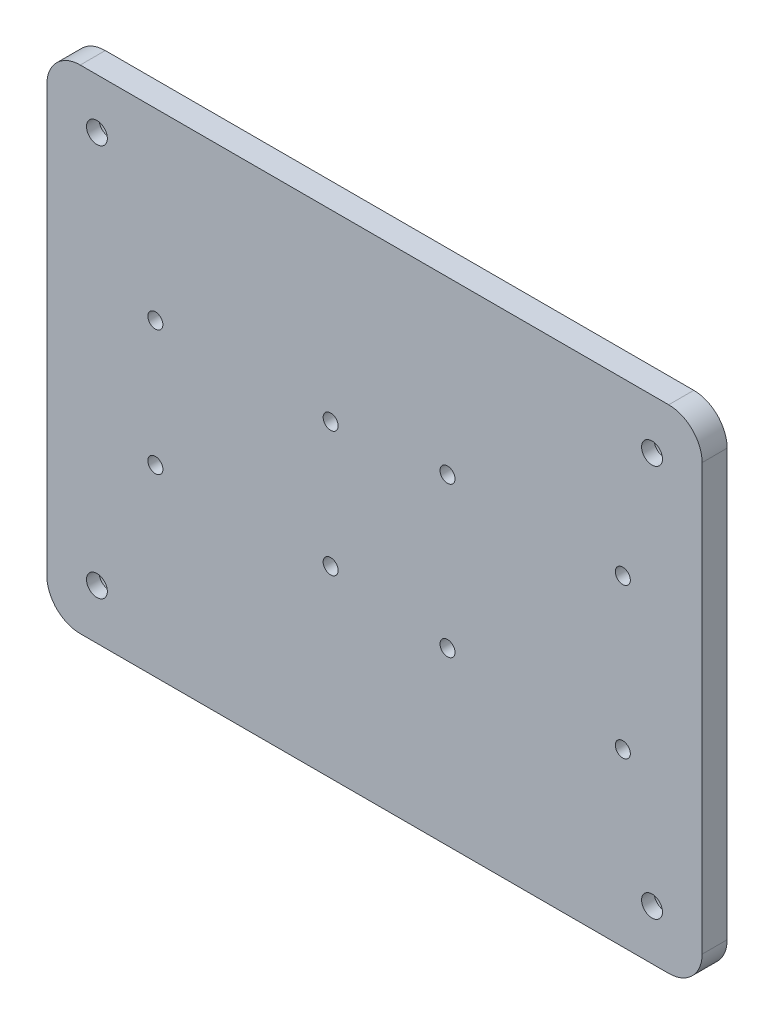
ISO-10303-21;
HEADER;
FILE_DESCRIPTION(('STEP AP214'),'2;1');
FILE_NAME('part.step','',(''),(''),'','','');
FILE_SCHEMA(('AUTOMOTIVE_DESIGN { 1 0 10303 214 1 1 1 1 }'));
ENDSEC;
DATA;
#1=APPLICATION_CONTEXT('core data for automotive mechanical design processes');
#2=APPLICATION_PROTOCOL_DEFINITION('international standard','automotive_design',2000,#1);
#3=PRODUCT_CONTEXT('',#1,'mechanical');
#4=PRODUCT('Part','Part','',(#3));
#5=PRODUCT_RELATED_PRODUCT_CATEGORY('part','',(#4));
#6=PRODUCT_DEFINITION_FORMATION('','',#4);
#7=PRODUCT_DEFINITION_CONTEXT('part definition',#1,'design');
#8=PRODUCT_DEFINITION('design','',#6,#7);
#9=PRODUCT_DEFINITION_SHAPE('','',#8);
#10=(LENGTH_UNIT() NAMED_UNIT(*) SI_UNIT(.MILLI.,.METRE.));
#11=(NAMED_UNIT(*) PLANE_ANGLE_UNIT() SI_UNIT($,.RADIAN.));
#12=(NAMED_UNIT(*) SI_UNIT($,.STERADIAN.) SOLID_ANGLE_UNIT());
#13=UNCERTAINTY_MEASURE_WITH_UNIT(LENGTH_MEASURE(1.E-05),#10,'distance_accuracy_value','');
#14=(GEOMETRIC_REPRESENTATION_CONTEXT(3) GLOBAL_UNCERTAINTY_ASSIGNED_CONTEXT((#13)) GLOBAL_UNIT_ASSIGNED_CONTEXT((#10,
#11,#12)) REPRESENTATION_CONTEXT('',''));
#15=CARTESIAN_POINT('',(0.,0.,0.));
#16=DIRECTION('',(0.,0.,1.));
#17=DIRECTION('',(1.,0.,0.));
#18=AXIS2_PLACEMENT_3D('',#15,#16,#17);
#19=CARTESIAN_POINT('',(174.,-12.,20.));
#20=DIRECTION('',(0.,0.,-1.));
#21=DIRECTION('',(-1.,0.,0.));
#22=AXIS2_PLACEMENT_3D('',#19,#20,#21);
#23=CYLINDRICAL_SURFACE('',#22,1.25000000000001);
#24=CARTESIAN_POINT('',(174.,-12.,20.));
#25=DIRECTION('',(0.,0.,-1.));
#26=DIRECTION('',(-1.,0.,0.));
#27=AXIS2_PLACEMENT_3D('',#24,#25,#26);
#28=CIRCLE('',#27,1.25000000000001);
#29=CARTESIAN_POINT('',(172.75,-12.,20.));
#30=VERTEX_POINT('',#29);
#31=EDGE_CURVE('E171',#30,#30,#28,.T.);
#32=ORIENTED_EDGE('',*,*,#31,.F.);
#33=EDGE_LOOP('',(#32));
#34=FACE_BOUND('',#33,.T.);
#35=CARTESIAN_POINT('',(174.,-12.,18.5));
#36=DIRECTION('',(0.,0.,-1.));
#37=DIRECTION('',(-1.,0.,0.));
#38=AXIS2_PLACEMENT_3D('',#35,#36,#37);
#39=CIRCLE('',#38,1.25000000000001);
#40=CARTESIAN_POINT('',(172.75,-12.,18.5));
#41=VERTEX_POINT('',#40);
#42=EDGE_CURVE('E178',#41,#41,#39,.F.);
#43=ORIENTED_EDGE('',*,*,#42,.F.);
#44=EDGE_LOOP('',(#43));
#45=FACE_BOUND('',#44,.T.);
#46=ADVANCED_FACE('F41',(#34,#45),#23,.F.);
#47=CARTESIAN_POINT('',(107.5,-12.,20.));
#48=DIRECTION('',(0.,0.,-1.));
#49=DIRECTION('',(-1.,0.,0.));
#50=AXIS2_PLACEMENT_3D('',#47,#48,#49);
#51=CYLINDRICAL_SURFACE('',#50,1.25000000000001);
#52=CARTESIAN_POINT('',(107.5,-12.,20.));
#53=DIRECTION('',(0.,0.,-1.));
#54=DIRECTION('',(-1.,0.,0.));
#55=AXIS2_PLACEMENT_3D('',#52,#53,#54);
#56=CIRCLE('',#55,1.25000000000001);
#57=CARTESIAN_POINT('',(106.25,-12.,20.));
#58=VERTEX_POINT('',#57);
#59=EDGE_CURVE('E168',#58,#58,#56,.T.);
#60=ORIENTED_EDGE('',*,*,#59,.F.);
#61=EDGE_LOOP('',(#60));
#62=FACE_BOUND('',#61,.T.);
#63=CARTESIAN_POINT('',(107.5,-12.,18.5));
#64=DIRECTION('',(0.,0.,-1.));
#65=DIRECTION('',(-1.,0.,0.));
#66=AXIS2_PLACEMENT_3D('',#63,#64,#65);
#67=CIRCLE('',#66,1.25000000000001);
#68=CARTESIAN_POINT('',(106.25,-12.,18.5));
#69=VERTEX_POINT('',#68);
#70=EDGE_CURVE('E191',#69,#69,#67,.F.);
#71=ORIENTED_EDGE('',*,*,#70,.F.);
#72=EDGE_LOOP('',(#71));
#73=FACE_BOUND('',#72,.T.);
#74=ADVANCED_FACE('F318',(#62,#73),#51,.F.);
#75=CARTESIAN_POINT('',(107.5,35.,20.));
#76=DIRECTION('',(0.,0.,-1.));
#77=DIRECTION('',(-1.,0.,0.));
#78=AXIS2_PLACEMENT_3D('',#75,#76,#77);
#79=CYLINDRICAL_SURFACE('',#78,1.25000000000001);
#80=CARTESIAN_POINT('',(107.5,35.,20.));
#81=DIRECTION('',(0.,0.,-1.));
#82=DIRECTION('',(-1.,0.,0.));
#83=AXIS2_PLACEMENT_3D('',#80,#81,#82);
#84=CIRCLE('',#83,1.25000000000001);
#85=CARTESIAN_POINT('',(106.25,35.,20.));
#86=VERTEX_POINT('',#85);
#87=EDGE_CURVE('E172',#86,#86,#84,.T.);
#88=ORIENTED_EDGE('',*,*,#87,.F.);
#89=EDGE_LOOP('',(#88));
#90=FACE_BOUND('',#89,.T.);
#91=CARTESIAN_POINT('',(107.5,35.,18.5));
#92=DIRECTION('',(0.,0.,-1.));
#93=DIRECTION('',(-1.,0.,0.));
#94=AXIS2_PLACEMENT_3D('',#91,#92,#93);
#95=CIRCLE('',#94,1.25000000000001);
#96=CARTESIAN_POINT('',(106.25,35.,18.5));
#97=VERTEX_POINT('',#96);
#98=EDGE_CURVE('E188',#97,#97,#95,.F.);
#99=ORIENTED_EDGE('',*,*,#98,.F.);
#100=EDGE_LOOP('',(#99));
#101=FACE_BOUND('',#100,.T.);
#102=ADVANCED_FACE('F324',(#90,#101),#79,.F.);
#103=CARTESIAN_POINT('',(174.,35.,20.));
#104=DIRECTION('',(0.,0.,-1.));
#105=DIRECTION('',(-1.,0.,0.));
#106=AXIS2_PLACEMENT_3D('',#103,#104,#105);
#107=CYLINDRICAL_SURFACE('',#106,1.25000000000001);
#108=CARTESIAN_POINT('',(174.,35.,20.));
#109=DIRECTION('',(0.,0.,-1.));
#110=DIRECTION('',(-1.,0.,0.));
#111=AXIS2_PLACEMENT_3D('',#108,#109,#110);
#112=CIRCLE('',#111,1.25000000000001);
#113=CARTESIAN_POINT('',(172.75,35.,20.));
#114=VERTEX_POINT('',#113);
#115=EDGE_CURVE('E175',#114,#114,#112,.T.);
#116=ORIENTED_EDGE('',*,*,#115,.F.);
#117=EDGE_LOOP('',(#116));
#118=FACE_BOUND('',#117,.T.);
#119=CARTESIAN_POINT('',(174.,35.,18.5));
#120=DIRECTION('',(0.,0.,-1.));
#121=DIRECTION('',(-1.,0.,0.));
#122=AXIS2_PLACEMENT_3D('',#119,#120,#121);
#123=CIRCLE('',#122,1.25000000000001);
#124=CARTESIAN_POINT('',(172.75,35.,18.5));
#125=VERTEX_POINT('',#124);
#126=EDGE_CURVE('E167',#125,#125,#123,.F.);
#127=ORIENTED_EDGE('',*,*,#126,.F.);
#128=EDGE_LOOP('',(#127));
#129=FACE_BOUND('',#128,.T.);
#130=ADVANCED_FACE('F284',(#118,#129),#107,.F.);
#131=CARTESIAN_POINT('',(140.,0.,17.));
#132=DIRECTION('',(0.,0.,1.));
#133=DIRECTION('',(1.,0.,0.));
#134=AXIS2_PLACEMENT_3D('',#131,#132,#133);
#135=PLANE('',#134);
#136=CARTESIAN_POINT('',(135.5,4.,17.));
#137=DIRECTION('',(0.,0.,-1.));
#138=DIRECTION('',(-1.,0.,0.));
#139=AXIS2_PLACEMENT_3D('',#136,#137,#138);
#140=CIRCLE('',#139,0.900000000000005);
#141=CARTESIAN_POINT('',(134.6,4.,17.));
#142=VERTEX_POINT('',#141);
#143=EDGE_CURVE('E253',#142,#142,#140,.T.);
#144=ORIENTED_EDGE('',*,*,#143,.F.);
#145=EDGE_LOOP('',(#144));
#146=FACE_BOUND('',#145,.T.);
#147=CARTESIAN_POINT('',(149.500000000001,2.49999999999999,17.));
#148=DIRECTION('',(0.,0.,-1.));
#149=DIRECTION('',(-1.,0.,0.));
#150=AXIS2_PLACEMENT_3D('',#147,#148,#149);
#151=CIRCLE('',#150,0.900000000000005);
#152=CARTESIAN_POINT('',(148.600000000001,2.49999999999999,17.));
#153=VERTEX_POINT('',#152);
#154=EDGE_CURVE('E242',#153,#153,#151,.T.);
#155=ORIENTED_EDGE('',*,*,#154,.F.);
#156=EDGE_LOOP('',(#155));
#157=FACE_BOUND('',#156,.T.);
#158=CARTESIAN_POINT('',(170.500000000001,2.5,17.));
#159=DIRECTION('',(0.,0.,-1.));
#160=DIRECTION('',(-1.,0.,0.));
#161=AXIS2_PLACEMENT_3D('',#158,#159,#160);
#162=CIRCLE('',#161,0.900000000000005);
#163=CARTESIAN_POINT('',(169.600000000001,2.5,17.));
#164=VERTEX_POINT('',#163);
#165=EDGE_CURVE('E241',#164,#164,#162,.T.);
#166=ORIENTED_EDGE('',*,*,#165,.F.);
#167=EDGE_LOOP('',(#166));
#168=FACE_BOUND('',#167,.T.);
#169=CARTESIAN_POINT('',(149.500000000001,20.5,17.));
#170=DIRECTION('',(0.,0.,-1.));
#171=DIRECTION('',(-1.,0.,0.));
#172=AXIS2_PLACEMENT_3D('',#169,#170,#171);
#173=CIRCLE('',#172,0.900000000000005);
#174=CARTESIAN_POINT('',(148.600000000001,20.5,17.));
#175=VERTEX_POINT('',#174);
#176=EDGE_CURVE('E235',#175,#175,#173,.T.);
#177=ORIENTED_EDGE('',*,*,#176,.F.);
#178=EDGE_LOOP('',(#177));
#179=FACE_BOUND('',#178,.T.);
#180=CARTESIAN_POINT('',(135.5,19.,17.));
#181=DIRECTION('',(0.,0.,-1.));
#182=DIRECTION('',(-1.,0.,0.));
#183=AXIS2_PLACEMENT_3D('',#180,#181,#182);
#184=CIRCLE('',#183,0.900000000000005);
#185=CARTESIAN_POINT('',(134.6,19.,17.));
#186=VERTEX_POINT('',#185);
#187=EDGE_CURVE('E254',#186,#186,#184,.T.);
#188=ORIENTED_EDGE('',*,*,#187,.F.);
#189=EDGE_LOOP('',(#188));
#190=FACE_BOUND('',#189,.T.);
#191=CARTESIAN_POINT('',(114.5,19.,17.));
#192=DIRECTION('',(0.,0.,-1.));
#193=DIRECTION('',(-1.,0.,0.));
#194=AXIS2_PLACEMENT_3D('',#191,#192,#193);
#195=CIRCLE('',#194,0.900000000000003);
#196=CARTESIAN_POINT('',(113.6,19.,17.));
#197=VERTEX_POINT('',#196);
#198=EDGE_CURVE('E271',#197,#197,#195,.T.);
#199=ORIENTED_EDGE('',*,*,#198,.F.);
#200=EDGE_LOOP('',(#199));
#201=FACE_BOUND('',#200,.T.);
#202=CARTESIAN_POINT('',(114.5,4.,17.));
#203=DIRECTION('',(0.,0.,-1.));
#204=DIRECTION('',(-1.,0.,0.));
#205=AXIS2_PLACEMENT_3D('',#202,#203,#204);
#206=CIRCLE('',#205,0.900000000000004);
#207=CARTESIAN_POINT('',(113.6,4.,17.));
#208=VERTEX_POINT('',#207);
#209=EDGE_CURVE('E265',#208,#208,#206,.T.);
#210=ORIENTED_EDGE('',*,*,#209,.F.);
#211=EDGE_LOOP('',(#210));
#212=FACE_BOUND('',#211,.T.);
#213=CARTESIAN_POINT('',(170.500000000001,20.5,17.));
#214=DIRECTION('',(0.,0.,-1.));
#215=DIRECTION('',(-1.,0.,0.));
#216=AXIS2_PLACEMENT_3D('',#213,#214,#215);
#217=CIRCLE('',#216,0.900000000000005);
#218=CARTESIAN_POINT('',(169.600000000001,20.5,17.));
#219=VERTEX_POINT('',#218);
#220=EDGE_CURVE('E232',#219,#219,#217,.T.);
#221=ORIENTED_EDGE('',*,*,#220,.F.);
#222=EDGE_LOOP('',(#221));
#223=FACE_BOUND('',#222,.T.);
#224=CARTESIAN_POINT('',(174.,35.,17.));
#225=DIRECTION('',(0.,0.,-1.));
#226=DIRECTION('',(-1.,0.,0.));
#227=AXIS2_PLACEMENT_3D('',#224,#225,#226);
#228=CIRCLE('',#227,2.);
#229=CARTESIAN_POINT('',(172.,35.,17.));
#230=VERTEX_POINT('',#229);
#231=EDGE_CURVE('E153',#230,#230,#228,.T.);
#232=ORIENTED_EDGE('',*,*,#231,.F.);
#233=EDGE_LOOP('',(#232));
#234=FACE_BOUND('',#233,.T.);
#235=CARTESIAN_POINT('',(107.5,35.,17.));
#236=DIRECTION('',(0.,0.,-1.));
#237=DIRECTION('',(-1.,0.,0.));
#238=AXIS2_PLACEMENT_3D('',#235,#236,#237);
#239=CIRCLE('',#238,2.);
#240=CARTESIAN_POINT('',(105.5,35.,17.));
#241=VERTEX_POINT('',#240);
#242=EDGE_CURVE('E146',#241,#241,#239,.T.);
#243=ORIENTED_EDGE('',*,*,#242,.F.);
#244=EDGE_LOOP('',(#243));
#245=FACE_BOUND('',#244,.T.);
#246=CARTESIAN_POINT('',(107.5,-12.,17.));
#247=DIRECTION('',(0.,0.,-1.));
#248=DIRECTION('',(-1.,0.,0.));
#249=AXIS2_PLACEMENT_3D('',#246,#247,#248);
#250=CIRCLE('',#249,2.);
#251=CARTESIAN_POINT('',(105.5,-12.,17.));
#252=VERTEX_POINT('',#251);
#253=EDGE_CURVE('E145',#252,#252,#250,.T.);
#254=ORIENTED_EDGE('',*,*,#253,.F.);
#255=EDGE_LOOP('',(#254));
#256=FACE_BOUND('',#255,.T.);
#257=CARTESIAN_POINT('',(174.,-12.,17.));
#258=DIRECTION('',(0.,0.,-1.));
#259=DIRECTION('',(-1.,0.,0.));
#260=AXIS2_PLACEMENT_3D('',#257,#258,#259);
#261=CIRCLE('',#260,2.);
#262=CARTESIAN_POINT('',(172.,-12.,17.));
#263=VERTEX_POINT('',#262);
#264=EDGE_CURVE('E149',#263,#263,#261,.T.);
#265=ORIENTED_EDGE('',*,*,#264,.F.);
#266=EDGE_LOOP('',(#265));
#267=FACE_BOUND('',#266,.T.);
#268=DIRECTION('',(1.,0.,0.));
#269=VECTOR('',#268,1.);
#270=CARTESIAN_POINT('',(0.,-18.,17.));
#271=LINE('',#270,#269);
#272=CARTESIAN_POINT('',(105.5,-18.,17.));
#273=VERTEX_POINT('',#272);
#274=CARTESIAN_POINT('',(176.,-18.,17.));
#275=VERTEX_POINT('',#274);
#276=EDGE_CURVE('E124',#273,#275,#271,.T.);
#277=ORIENTED_EDGE('',*,*,#276,.F.);
#278=CARTESIAN_POINT('',(105.5,-14.,17.));
#279=DIRECTION('',(0.,0.,1.));
#280=DIRECTION('',(1.,0.,0.));
#281=AXIS2_PLACEMENT_3D('',#278,#279,#280);
#282=CIRCLE('',#281,4.);
#283=CARTESIAN_POINT('',(101.5,-14.,17.));
#284=VERTEX_POINT('',#283);
#285=EDGE_CURVE('E107',#273,#284,#282,.F.);
#286=ORIENTED_EDGE('',*,*,#285,.T.);
#287=DIRECTION('',(0.,-1.,0.));
#288=VECTOR('',#287,1.);
#289=CARTESIAN_POINT('',(101.5,0.,17.));
#290=LINE('',#289,#288);
#291=CARTESIAN_POINT('',(101.5,37.,17.));
#292=VERTEX_POINT('',#291);
#293=EDGE_CURVE('E134',#292,#284,#290,.T.);
#294=ORIENTED_EDGE('',*,*,#293,.F.);
#295=CARTESIAN_POINT('',(105.5,37.,17.));
#296=DIRECTION('',(0.,0.,1.));
#297=DIRECTION('',(1.,0.,0.));
#298=AXIS2_PLACEMENT_3D('',#295,#296,#297);
#299=CIRCLE('',#298,4.);
#300=CARTESIAN_POINT('',(105.5,41.,17.));
#301=VERTEX_POINT('',#300);
#302=EDGE_CURVE('E118',#292,#301,#299,.F.);
#303=ORIENTED_EDGE('',*,*,#302,.T.);
#304=DIRECTION('',(-1.,0.,0.));
#305=VECTOR('',#304,1.);
#306=CARTESIAN_POINT('',(0.,41.,17.));
#307=LINE('',#306,#305);
#308=CARTESIAN_POINT('',(176.,41.,17.));
#309=VERTEX_POINT('',#308);
#310=EDGE_CURVE('E133',#309,#301,#307,.T.);
#311=ORIENTED_EDGE('',*,*,#310,.F.);
#312=CARTESIAN_POINT('',(176.,37.,17.));
#313=DIRECTION('',(0.,0.,1.));
#314=DIRECTION('',(1.,0.,0.));
#315=AXIS2_PLACEMENT_3D('',#312,#313,#314);
#316=CIRCLE('',#315,4.);
#317=CARTESIAN_POINT('',(180.,37.,17.));
#318=VERTEX_POINT('',#317);
#319=EDGE_CURVE('E198',#309,#318,#316,.F.);
#320=ORIENTED_EDGE('',*,*,#319,.T.);
#321=DIRECTION('',(0.,1.,0.));
#322=VECTOR('',#321,1.);
#323=CARTESIAN_POINT('',(180.,43.,17.));
#324=LINE('',#323,#322);
#325=CARTESIAN_POINT('',(180.,-14.,17.));
#326=VERTEX_POINT('',#325);
#327=EDGE_CURVE('E183',#326,#318,#324,.T.);
#328=ORIENTED_EDGE('',*,*,#327,.F.);
#329=CARTESIAN_POINT('',(176.,-14.,17.));
#330=DIRECTION('',(0.,0.,1.));
#331=DIRECTION('',(1.,0.,0.));
#332=AXIS2_PLACEMENT_3D('',#329,#330,#331);
#333=CIRCLE('',#332,4.);
#334=EDGE_CURVE('E128',#326,#275,#333,.F.);
#335=ORIENTED_EDGE('',*,*,#334,.T.);
#336=EDGE_LOOP('',(#277,#286,#294,#303,#311,#320,#328,#335));
#337=FACE_BOUND('',#336,.T.);
#338=ADVANCED_FACE('F131',(#146,#157,#168,#179,#190,#201,#212,#223,#234,#245,#256,#267,#337),
#135,.F.);
#339=CARTESIAN_POINT('',(180.,43.,-90.8204526052455));
#340=DIRECTION('',(1.,0.,0.));
#341=DIRECTION('',(0.,0.,-1.));
#342=AXIS2_PLACEMENT_3D('',#339,#340,#341);
#343=PLANE('',#342);
#344=ORIENTED_EDGE('',*,*,#327,.T.);
#345=DIRECTION('',(0.,0.,-1.));
#346=VECTOR('',#345,1.);
#347=CARTESIAN_POINT('',(180.,37.,20.));
#348=LINE('',#347,#346);
#349=CARTESIAN_POINT('',(180.,37.,20.));
#350=VERTEX_POINT('',#349);
#351=EDGE_CURVE('E12',#318,#350,#348,.F.);
#352=ORIENTED_EDGE('',*,*,#351,.T.);
#353=DIRECTION('',(0.,1.,0.));
#354=VECTOR('',#353,1.);
#355=CARTESIAN_POINT('',(180.,43.,20.));
#356=LINE('',#355,#354);
#357=CARTESIAN_POINT('',(180.,-14.,20.));
#358=VERTEX_POINT('',#357);
#359=EDGE_CURVE('E181',#358,#350,#356,.T.);
#360=ORIENTED_EDGE('',*,*,#359,.F.);
#361=DIRECTION('',(0.,0.,-1.));
#362=VECTOR('',#361,1.);
#363=CARTESIAN_POINT('',(180.,-14.,17.));
#364=LINE('',#363,#362);
#365=EDGE_CURVE('E49',#358,#326,#364,.T.);
#366=ORIENTED_EDGE('',*,*,#365,.T.);
#367=EDGE_LOOP('',(#344,#352,#360,#366));
#368=FACE_BOUND('',#367,.T.);
#369=ADVANCED_FACE('F218',(#368),#343,.T.);
#370=CARTESIAN_POINT('',(0.,23.,20.));
#371=DIRECTION('',(0.,0.,-1.));
#372=DIRECTION('',(-1.,0.,0.));
#373=AXIS2_PLACEMENT_3D('',#370,#371,#372);
#374=PLANE('',#373);
#375=CARTESIAN_POINT('',(135.5,4.,20.));
#376=DIRECTION('',(0.,0.,-1.));
#377=DIRECTION('',(-1.,0.,0.));
#378=AXIS2_PLACEMENT_3D('',#375,#376,#377);
#379=CIRCLE('',#378,0.900000000000005);
#380=CARTESIAN_POINT('',(134.6,4.,20.));
#381=VERTEX_POINT('',#380);
#382=EDGE_CURVE('E250',#381,#381,#379,.T.);
#383=ORIENTED_EDGE('',*,*,#382,.T.);
#384=EDGE_LOOP('',(#383));
#385=FACE_BOUND('',#384,.T.);
#386=CARTESIAN_POINT('',(149.500000000001,2.49999999999999,20.));
#387=DIRECTION('',(0.,0.,-1.));
#388=DIRECTION('',(-1.,0.,0.));
#389=AXIS2_PLACEMENT_3D('',#386,#387,#388);
#390=CIRCLE('',#389,0.900000000000005);
#391=CARTESIAN_POINT('',(148.600000000001,2.49999999999999,20.));
#392=VERTEX_POINT('',#391);
#393=EDGE_CURVE('E257',#392,#392,#390,.T.);
#394=ORIENTED_EDGE('',*,*,#393,.T.);
#395=EDGE_LOOP('',(#394));
#396=FACE_BOUND('',#395,.T.);
#397=CARTESIAN_POINT('',(170.500000000001,2.5,20.));
#398=DIRECTION('',(0.,0.,-1.));
#399=DIRECTION('',(-1.,0.,0.));
#400=AXIS2_PLACEMENT_3D('',#397,#398,#399);
#401=CIRCLE('',#400,0.900000000000005);
#402=CARTESIAN_POINT('',(169.600000000001,2.5,20.));
#403=VERTEX_POINT('',#402);
#404=EDGE_CURVE('E238',#403,#403,#401,.T.);
#405=ORIENTED_EDGE('',*,*,#404,.T.);
#406=EDGE_LOOP('',(#405));
#407=FACE_BOUND('',#406,.T.);
#408=CARTESIAN_POINT('',(149.500000000001,20.5,20.));
#409=DIRECTION('',(0.,0.,-1.));
#410=DIRECTION('',(-1.,0.,0.));
#411=AXIS2_PLACEMENT_3D('',#408,#409,#410);
#412=CIRCLE('',#411,0.900000000000005);
#413=CARTESIAN_POINT('',(148.600000000001,20.5,20.));
#414=VERTEX_POINT('',#413);
#415=EDGE_CURVE('E245',#414,#414,#412,.T.);
#416=ORIENTED_EDGE('',*,*,#415,.T.);
#417=EDGE_LOOP('',(#416));
#418=FACE_BOUND('',#417,.T.);
#419=CARTESIAN_POINT('',(135.5,19.,20.));
#420=DIRECTION('',(0.,0.,-1.));
#421=DIRECTION('',(-1.,0.,0.));
#422=AXIS2_PLACEMENT_3D('',#419,#420,#421);
#423=CIRCLE('',#422,0.900000000000005);
#424=CARTESIAN_POINT('',(134.6,19.,20.));
#425=VERTEX_POINT('',#424);
#426=EDGE_CURVE('E274',#425,#425,#423,.T.);
#427=ORIENTED_EDGE('',*,*,#426,.T.);
#428=EDGE_LOOP('',(#427));
#429=FACE_BOUND('',#428,.T.);
#430=CARTESIAN_POINT('',(114.5,19.,20.));
#431=DIRECTION('',(0.,0.,-1.));
#432=DIRECTION('',(-1.,0.,0.));
#433=AXIS2_PLACEMENT_3D('',#430,#431,#432);
#434=CIRCLE('',#433,0.900000000000003);
#435=CARTESIAN_POINT('',(113.6,19.,20.));
#436=VERTEX_POINT('',#435);
#437=EDGE_CURVE('E268',#436,#436,#434,.T.);
#438=ORIENTED_EDGE('',*,*,#437,.T.);
#439=EDGE_LOOP('',(#438));
#440=FACE_BOUND('',#439,.T.);
#441=CARTESIAN_POINT('',(114.5,4.,20.));
#442=DIRECTION('',(0.,0.,-1.));
#443=DIRECTION('',(-1.,0.,0.));
#444=AXIS2_PLACEMENT_3D('',#441,#442,#443);
#445=CIRCLE('',#444,0.900000000000004);
#446=CARTESIAN_POINT('',(113.6,4.,20.));
#447=VERTEX_POINT('',#446);
#448=EDGE_CURVE('E262',#447,#447,#445,.T.);
#449=ORIENTED_EDGE('',*,*,#448,.T.);
#450=EDGE_LOOP('',(#449));
#451=FACE_BOUND('',#450,.T.);
#452=CARTESIAN_POINT('',(170.500000000001,20.5,20.));
#453=DIRECTION('',(0.,0.,-1.));
#454=DIRECTION('',(-1.,0.,0.));
#455=AXIS2_PLACEMENT_3D('',#452,#453,#454);
#456=CIRCLE('',#455,0.900000000000005);
#457=CARTESIAN_POINT('',(169.600000000001,20.5,20.));
#458=VERTEX_POINT('',#457);
#459=EDGE_CURVE('E138',#458,#458,#456,.T.);
#460=ORIENTED_EDGE('',*,*,#459,.T.);
#461=EDGE_LOOP('',(#460));
#462=FACE_BOUND('',#461,.T.);
#463=ORIENTED_EDGE('',*,*,#115,.T.);
#464=EDGE_LOOP('',(#463));
#465=FACE_BOUND('',#464,.T.);
#466=ORIENTED_EDGE('',*,*,#87,.T.);
#467=EDGE_LOOP('',(#466));
#468=FACE_BOUND('',#467,.T.);
#469=ORIENTED_EDGE('',*,*,#59,.T.);
#470=EDGE_LOOP('',(#469));
#471=FACE_BOUND('',#470,.T.);
#472=ORIENTED_EDGE('',*,*,#31,.T.);
#473=EDGE_LOOP('',(#472));
#474=FACE_BOUND('',#473,.T.);
#475=DIRECTION('',(0.,-1.,0.));
#476=VECTOR('',#475,1.);
#477=CARTESIAN_POINT('',(101.5,0.,20.));
#478=LINE('',#477,#476);
#479=CARTESIAN_POINT('',(101.5,37.,20.));
#480=VERTEX_POINT('',#479);
#481=CARTESIAN_POINT('',(101.5,-14.,20.));
#482=VERTEX_POINT('',#481);
#483=EDGE_CURVE('E136',#480,#482,#478,.T.);
#484=ORIENTED_EDGE('',*,*,#483,.T.);
#485=CARTESIAN_POINT('',(105.5,-14.,20.));
#486=DIRECTION('',(0.,0.,-1.));
#487=DIRECTION('',(-1.,0.,0.));
#488=AXIS2_PLACEMENT_3D('',#485,#486,#487);
#489=CIRCLE('',#488,4.);
#490=CARTESIAN_POINT('',(105.5,-18.,20.));
#491=VERTEX_POINT('',#490);
#492=EDGE_CURVE('E209',#482,#491,#489,.F.);
#493=ORIENTED_EDGE('',*,*,#492,.T.);
#494=DIRECTION('',(1.,0.,0.));
#495=VECTOR('',#494,1.);
#496=CARTESIAN_POINT('',(0.,-18.,20.));
#497=LINE('',#496,#495);
#498=CARTESIAN_POINT('',(176.,-18.,20.));
#499=VERTEX_POINT('',#498);
#500=EDGE_CURVE('E127',#491,#499,#497,.T.);
#501=ORIENTED_EDGE('',*,*,#500,.T.);
#502=CARTESIAN_POINT('',(176.,-14.,20.));
#503=DIRECTION('',(0.,0.,-1.));
#504=DIRECTION('',(-1.,0.,0.));
#505=AXIS2_PLACEMENT_3D('',#502,#503,#504);
#506=CIRCLE('',#505,4.);
#507=EDGE_CURVE('E204',#499,#358,#506,.F.);
#508=ORIENTED_EDGE('',*,*,#507,.T.);
#509=ORIENTED_EDGE('',*,*,#359,.T.);
#510=CARTESIAN_POINT('',(176.,37.,20.));
#511=DIRECTION('',(0.,0.,-1.));
#512=DIRECTION('',(-1.,0.,0.));
#513=AXIS2_PLACEMENT_3D('',#510,#511,#512);
#514=CIRCLE('',#513,4.);
#515=CARTESIAN_POINT('',(176.,41.,20.));
#516=VERTEX_POINT('',#515);
#517=EDGE_CURVE('E63',#350,#516,#514,.F.);
#518=ORIENTED_EDGE('',*,*,#517,.T.);
#519=DIRECTION('',(-1.,0.,0.));
#520=VECTOR('',#519,1.);
#521=CARTESIAN_POINT('',(0.,41.,20.));
#522=LINE('',#521,#520);
#523=CARTESIAN_POINT('',(105.5,41.,20.));
#524=VERTEX_POINT('',#523);
#525=EDGE_CURVE('E159',#516,#524,#522,.T.);
#526=ORIENTED_EDGE('',*,*,#525,.T.);
#527=CARTESIAN_POINT('',(105.5,37.,20.));
#528=DIRECTION('',(0.,0.,-1.));
#529=DIRECTION('',(-1.,0.,0.));
#530=AXIS2_PLACEMENT_3D('',#527,#528,#529);
#531=CIRCLE('',#530,4.);
#532=EDGE_CURVE('E207',#524,#480,#531,.F.);
#533=ORIENTED_EDGE('',*,*,#532,.T.);
#534=EDGE_LOOP('',(#484,#493,#501,#508,#509,#518,#526,#533));
#535=FACE_BOUND('',#534,.T.);
#536=ADVANCED_FACE('F332',(#385,#396,#407,#418,#429,#440,#451,#462,#465,#468,#471,#474,#535),
#374,.F.);
#537=CARTESIAN_POINT('',(0.,23.,18.5));
#538=DIRECTION('',(0.,0.,-1.));
#539=DIRECTION('',(-1.,0.,0.));
#540=AXIS2_PLACEMENT_3D('',#537,#538,#539);
#541=PLANE('',#540);
#542=CARTESIAN_POINT('',(174.,35.,18.5));
#543=DIRECTION('',(0.,0.,-1.));
#544=DIRECTION('',(-1.,0.,0.));
#545=AXIS2_PLACEMENT_3D('',#542,#543,#544);
#546=CIRCLE('',#545,2.);
#547=CARTESIAN_POINT('',(172.,35.,18.5));
#548=VERTEX_POINT('',#547);
#549=EDGE_CURVE('E156',#548,#548,#546,.F.);
#550=ORIENTED_EDGE('',*,*,#549,.F.);
#551=EDGE_LOOP('',(#550));
#552=FACE_BOUND('',#551,.T.);
#553=ORIENTED_EDGE('',*,*,#126,.T.);
#554=EDGE_LOOP('',(#553));
#555=FACE_BOUND('',#554,.T.);
#556=ADVANCED_FACE('F336',(#552,#555),#541,.T.);
#557=CARTESIAN_POINT('',(174.,35.,25.6568542494924));
#558=DIRECTION('',(0.,0.,-1.));
#559=DIRECTION('',(-1.,0.,0.));
#560=AXIS2_PLACEMENT_3D('',#557,#558,#559);
#561=CYLINDRICAL_SURFACE('',#560,2.);
#562=ORIENTED_EDGE('',*,*,#549,.T.);
#563=EDGE_LOOP('',(#562));
#564=FACE_BOUND('',#563,.T.);
#565=ORIENTED_EDGE('',*,*,#231,.T.);
#566=EDGE_LOOP('',(#565));
#567=FACE_BOUND('',#566,.T.);
#568=ADVANCED_FACE('F386',(#564,#567),#561,.F.);
#569=CARTESIAN_POINT('',(0.,23.,18.5));
#570=DIRECTION('',(0.,0.,-1.));
#571=DIRECTION('',(-1.,0.,0.));
#572=AXIS2_PLACEMENT_3D('',#569,#570,#571);
#573=PLANE('',#572);
#574=CARTESIAN_POINT('',(107.5,35.,18.5));
#575=DIRECTION('',(0.,0.,-1.));
#576=DIRECTION('',(-1.,0.,0.));
#577=AXIS2_PLACEMENT_3D('',#574,#575,#576);
#578=CIRCLE('',#577,2.);
#579=CARTESIAN_POINT('',(105.5,35.,18.5));
#580=VERTEX_POINT('',#579);
#581=EDGE_CURVE('E150',#580,#580,#578,.F.);
#582=ORIENTED_EDGE('',*,*,#581,.F.);
#583=EDGE_LOOP('',(#582));
#584=FACE_BOUND('',#583,.T.);
#585=ORIENTED_EDGE('',*,*,#98,.T.);
#586=EDGE_LOOP('',(#585));
#587=FACE_BOUND('',#586,.T.);
#588=ADVANCED_FACE('F382',(#584,#587),#573,.T.);
#589=CARTESIAN_POINT('',(107.5,35.,25.6568542494924));
#590=DIRECTION('',(0.,0.,-1.));
#591=DIRECTION('',(-1.,0.,0.));
#592=AXIS2_PLACEMENT_3D('',#589,#590,#591);
#593=CYLINDRICAL_SURFACE('',#592,2.);
#594=ORIENTED_EDGE('',*,*,#581,.T.);
#595=EDGE_LOOP('',(#594));
#596=FACE_BOUND('',#595,.T.);
#597=ORIENTED_EDGE('',*,*,#242,.T.);
#598=EDGE_LOOP('',(#597));
#599=FACE_BOUND('',#598,.T.);
#600=ADVANCED_FACE('F378',(#596,#599),#593,.F.);
#601=CARTESIAN_POINT('',(0.,23.,18.5));
#602=DIRECTION('',(0.,0.,-1.));
#603=DIRECTION('',(-1.,0.,0.));
#604=AXIS2_PLACEMENT_3D('',#601,#602,#603);
#605=PLANE('',#604);
#606=CARTESIAN_POINT('',(107.5,-12.,18.5));
#607=DIRECTION('',(0.,0.,-1.));
#608=DIRECTION('',(-1.,0.,0.));
#609=AXIS2_PLACEMENT_3D('',#606,#607,#608);
#610=CIRCLE('',#609,2.);
#611=CARTESIAN_POINT('',(105.5,-12.,18.5));
#612=VERTEX_POINT('',#611);
#613=EDGE_CURVE('E142',#612,#612,#610,.F.);
#614=ORIENTED_EDGE('',*,*,#613,.F.);
#615=EDGE_LOOP('',(#614));
#616=FACE_BOUND('',#615,.T.);
#617=ORIENTED_EDGE('',*,*,#70,.T.);
#618=EDGE_LOOP('',(#617));
#619=FACE_BOUND('',#618,.T.);
#620=ADVANCED_FACE('F374',(#616,#619),#605,.T.);
#621=CARTESIAN_POINT('',(107.5,-12.,25.6568542494924));
#622=DIRECTION('',(0.,0.,-1.));
#623=DIRECTION('',(-1.,0.,0.));
#624=AXIS2_PLACEMENT_3D('',#621,#622,#623);
#625=CYLINDRICAL_SURFACE('',#624,2.);
#626=ORIENTED_EDGE('',*,*,#613,.T.);
#627=EDGE_LOOP('',(#626));
#628=FACE_BOUND('',#627,.T.);
#629=ORIENTED_EDGE('',*,*,#253,.T.);
#630=EDGE_LOOP('',(#629));
#631=FACE_BOUND('',#630,.T.);
#632=ADVANCED_FACE('F313',(#628,#631),#625,.F.);
#633=CARTESIAN_POINT('',(0.,23.,18.5));
#634=DIRECTION('',(0.,0.,-1.));
#635=DIRECTION('',(-1.,0.,0.));
#636=AXIS2_PLACEMENT_3D('',#633,#634,#635);
#637=PLANE('',#636);
#638=CARTESIAN_POINT('',(174.,-12.,18.5));
#639=DIRECTION('',(0.,0.,-1.));
#640=DIRECTION('',(-1.,0.,0.));
#641=AXIS2_PLACEMENT_3D('',#638,#639,#640);
#642=CIRCLE('',#641,2.);
#643=CARTESIAN_POINT('',(172.,-12.,18.5));
#644=VERTEX_POINT('',#643);
#645=EDGE_CURVE('E164',#644,#644,#642,.F.);
#646=ORIENTED_EDGE('',*,*,#645,.F.);
#647=EDGE_LOOP('',(#646));
#648=FACE_BOUND('',#647,.T.);
#649=ORIENTED_EDGE('',*,*,#42,.T.);
#650=EDGE_LOOP('',(#649));
#651=FACE_BOUND('',#650,.T.);
#652=ADVANCED_FACE('F304',(#648,#651),#637,.T.);
#653=CARTESIAN_POINT('',(174.,-12.,25.6568542494924));
#654=DIRECTION('',(0.,0.,-1.));
#655=DIRECTION('',(-1.,0.,0.));
#656=AXIS2_PLACEMENT_3D('',#653,#654,#655);
#657=CYLINDRICAL_SURFACE('',#656,2.);
#658=ORIENTED_EDGE('',*,*,#645,.T.);
#659=EDGE_LOOP('',(#658));
#660=FACE_BOUND('',#659,.T.);
#661=ORIENTED_EDGE('',*,*,#264,.T.);
#662=EDGE_LOOP('',(#661));
#663=FACE_BOUND('',#662,.T.);
#664=ADVANCED_FACE('F301',(#660,#663),#657,.F.);
#665=CARTESIAN_POINT('',(101.5,0.,20.));
#666=DIRECTION('',(1.,0.,0.));
#667=DIRECTION('',(0.,0.,-1.));
#668=AXIS2_PLACEMENT_3D('',#665,#666,#667);
#669=PLANE('',#668);
#670=ORIENTED_EDGE('',*,*,#293,.T.);
#671=DIRECTION('',(0.,0.,-1.));
#672=VECTOR('',#671,1.);
#673=CARTESIAN_POINT('',(101.5,-14.,20.));
#674=LINE('',#673,#672);
#675=EDGE_CURVE('E112',#284,#482,#674,.F.);
#676=ORIENTED_EDGE('',*,*,#675,.T.);
#677=ORIENTED_EDGE('',*,*,#483,.F.);
#678=DIRECTION('',(0.,0.,-1.));
#679=VECTOR('',#678,1.);
#680=CARTESIAN_POINT('',(101.5,37.,20.));
#681=LINE('',#680,#679);
#682=EDGE_CURVE('E117',#480,#292,#681,.T.);
#683=ORIENTED_EDGE('',*,*,#682,.T.);
#684=EDGE_LOOP('',(#670,#676,#677,#683));
#685=FACE_BOUND('',#684,.T.);
#686=ADVANCED_FACE('F303',(#685),#669,.F.);
#687=CARTESIAN_POINT('',(0.,41.,20.));
#688=DIRECTION('',(0.,-1.,0.));
#689=DIRECTION('',(0.,0.,-1.));
#690=AXIS2_PLACEMENT_3D('',#687,#688,#689);
#691=PLANE('',#690);
#692=ORIENTED_EDGE('',*,*,#310,.T.);
#693=DIRECTION('',(0.,0.,-1.));
#694=VECTOR('',#693,1.);
#695=CARTESIAN_POINT('',(105.5,41.,20.));
#696=LINE('',#695,#694);
#697=EDGE_CURVE('E56',#301,#524,#696,.F.);
#698=ORIENTED_EDGE('',*,*,#697,.T.);
#699=ORIENTED_EDGE('',*,*,#525,.F.);
#700=DIRECTION('',(0.,0.,-1.));
#701=VECTOR('',#700,1.);
#702=CARTESIAN_POINT('',(176.,41.,17.));
#703=LINE('',#702,#701);
#704=EDGE_CURVE('E211',#516,#309,#703,.T.);
#705=ORIENTED_EDGE('',*,*,#704,.T.);
#706=EDGE_LOOP('',(#692,#698,#699,#705));
#707=FACE_BOUND('',#706,.T.);
#708=ADVANCED_FACE('F226',(#707),#691,.F.);
#709=CARTESIAN_POINT('',(0.,-18.,20.));
#710=DIRECTION('',(0.,1.,0.));
#711=DIRECTION('',(-1.,0.,0.));
#712=AXIS2_PLACEMENT_3D('',#709,#710,#711);
#713=PLANE('',#712);
#714=ORIENTED_EDGE('',*,*,#500,.F.);
#715=DIRECTION('',(0.,0.,-1.));
#716=VECTOR('',#715,1.);
#717=CARTESIAN_POINT('',(105.5,-18.,20.));
#718=LINE('',#717,#716);
#719=EDGE_CURVE('E111',#491,#273,#718,.T.);
#720=ORIENTED_EDGE('',*,*,#719,.T.);
#721=ORIENTED_EDGE('',*,*,#276,.T.);
#722=DIRECTION('',(0.,0.,-1.));
#723=VECTOR('',#722,1.);
#724=CARTESIAN_POINT('',(176.,-18.,20.));
#725=LINE('',#724,#723);
#726=EDGE_CURVE('E129',#275,#499,#725,.F.);
#727=ORIENTED_EDGE('',*,*,#726,.T.);
#728=EDGE_LOOP('',(#714,#720,#721,#727));
#729=FACE_BOUND('',#728,.T.);
#730=ADVANCED_FACE('F123',(#729),#713,.F.);
#731=CARTESIAN_POINT('',(105.5,-14.,20.));
#732=DIRECTION('',(0.,0.,-1.));
#733=DIRECTION('',(-1.,0.,0.));
#734=AXIS2_PLACEMENT_3D('',#731,#732,#733);
#735=CYLINDRICAL_SURFACE('',#734,4.);
#736=ORIENTED_EDGE('',*,*,#492,.F.);
#737=ORIENTED_EDGE('',*,*,#675,.F.);
#738=ORIENTED_EDGE('',*,*,#285,.F.);
#739=ORIENTED_EDGE('',*,*,#719,.F.);
#740=EDGE_LOOP('',(#736,#737,#738,#739));
#741=FACE_BOUND('',#740,.T.);
#742=ADVANCED_FACE('F110',(#741),#735,.T.);
#743=CARTESIAN_POINT('',(105.5,37.,20.));
#744=DIRECTION('',(0.,0.,-1.));
#745=DIRECTION('',(-1.,0.,0.));
#746=AXIS2_PLACEMENT_3D('',#743,#744,#745);
#747=CYLINDRICAL_SURFACE('',#746,4.);
#748=ORIENTED_EDGE('',*,*,#532,.F.);
#749=ORIENTED_EDGE('',*,*,#697,.F.);
#750=ORIENTED_EDGE('',*,*,#302,.F.);
#751=ORIENTED_EDGE('',*,*,#682,.F.);
#752=EDGE_LOOP('',(#748,#749,#750,#751));
#753=FACE_BOUND('',#752,.T.);
#754=ADVANCED_FACE('F340',(#753),#747,.T.);
#755=CARTESIAN_POINT('',(176.,37.,20.));
#756=DIRECTION('',(0.,0.,1.));
#757=DIRECTION('',(1.,0.,0.));
#758=AXIS2_PLACEMENT_3D('',#755,#756,#757);
#759=CYLINDRICAL_SURFACE('',#758,4.);
#760=ORIENTED_EDGE('',*,*,#517,.F.);
#761=ORIENTED_EDGE('',*,*,#351,.F.);
#762=ORIENTED_EDGE('',*,*,#319,.F.);
#763=ORIENTED_EDGE('',*,*,#704,.F.);
#764=EDGE_LOOP('',(#760,#761,#762,#763));
#765=FACE_BOUND('',#764,.T.);
#766=ADVANCED_FACE('F225',(#765),#759,.T.);
#767=CARTESIAN_POINT('',(176.,-14.,-90.8204526052455));
#768=DIRECTION('',(0.,0.,1.));
#769=DIRECTION('',(1.,0.,0.));
#770=AXIS2_PLACEMENT_3D('',#767,#768,#769);
#771=CYLINDRICAL_SURFACE('',#770,4.);
#772=ORIENTED_EDGE('',*,*,#507,.F.);
#773=ORIENTED_EDGE('',*,*,#726,.F.);
#774=ORIENTED_EDGE('',*,*,#334,.F.);
#775=ORIENTED_EDGE('',*,*,#365,.F.);
#776=EDGE_LOOP('',(#772,#773,#774,#775));
#777=FACE_BOUND('',#776,.T.);
#778=ADVANCED_FACE('F43',(#777),#771,.T.);
#779=CARTESIAN_POINT('',(170.500000000001,20.5,20.));
#780=DIRECTION('',(0.,0.,-1.));
#781=DIRECTION('',(-1.,0.,0.));
#782=AXIS2_PLACEMENT_3D('',#779,#780,#781);
#783=CYLINDRICAL_SURFACE('',#782,0.900000000000005);
#784=ORIENTED_EDGE('',*,*,#459,.F.);
#785=EDGE_LOOP('',(#784));
#786=FACE_BOUND('',#785,.T.);
#787=ORIENTED_EDGE('',*,*,#220,.T.);
#788=EDGE_LOOP('',(#787));
#789=FACE_BOUND('',#788,.T.);
#790=ADVANCED_FACE('F347',(#786,#789),#783,.F.);
#791=CARTESIAN_POINT('',(114.5,4.,20.));
#792=DIRECTION('',(0.,0.,-1.));
#793=DIRECTION('',(-1.,0.,0.));
#794=AXIS2_PLACEMENT_3D('',#791,#792,#793);
#795=CYLINDRICAL_SURFACE('',#794,0.900000000000004);
#796=ORIENTED_EDGE('',*,*,#448,.F.);
#797=EDGE_LOOP('',(#796));
#798=FACE_BOUND('',#797,.T.);
#799=ORIENTED_EDGE('',*,*,#209,.T.);
#800=EDGE_LOOP('',(#799));
#801=FACE_BOUND('',#800,.T.);
#802=ADVANCED_FACE('F351',(#798,#801),#795,.F.);
#803=CARTESIAN_POINT('',(114.5,19.,20.));
#804=DIRECTION('',(0.,0.,-1.));
#805=DIRECTION('',(-1.,0.,0.));
#806=AXIS2_PLACEMENT_3D('',#803,#804,#805);
#807=CYLINDRICAL_SURFACE('',#806,0.900000000000003);
#808=ORIENTED_EDGE('',*,*,#437,.F.);
#809=EDGE_LOOP('',(#808));
#810=FACE_BOUND('',#809,.T.);
#811=ORIENTED_EDGE('',*,*,#198,.T.);
#812=EDGE_LOOP('',(#811));
#813=FACE_BOUND('',#812,.T.);
#814=ADVANCED_FACE('F359',(#810,#813),#807,.F.);
#815=CARTESIAN_POINT('',(135.5,19.,20.));
#816=DIRECTION('',(0.,0.,-1.));
#817=DIRECTION('',(-1.,0.,0.));
#818=AXIS2_PLACEMENT_3D('',#815,#816,#817);
#819=CYLINDRICAL_SURFACE('',#818,0.900000000000005);
#820=ORIENTED_EDGE('',*,*,#426,.F.);
#821=EDGE_LOOP('',(#820));
#822=FACE_BOUND('',#821,.T.);
#823=ORIENTED_EDGE('',*,*,#187,.T.);
#824=EDGE_LOOP('',(#823));
#825=FACE_BOUND('',#824,.T.);
#826=ADVANCED_FACE('F280',(#822,#825),#819,.F.);
#827=CARTESIAN_POINT('',(149.500000000001,20.5,20.));
#828=DIRECTION('',(0.,0.,-1.));
#829=DIRECTION('',(-1.,0.,0.));
#830=AXIS2_PLACEMENT_3D('',#827,#828,#829);
#831=CYLINDRICAL_SURFACE('',#830,0.900000000000005);
#832=ORIENTED_EDGE('',*,*,#415,.F.);
#833=EDGE_LOOP('',(#832));
#834=FACE_BOUND('',#833,.T.);
#835=ORIENTED_EDGE('',*,*,#176,.T.);
#836=EDGE_LOOP('',(#835));
#837=FACE_BOUND('',#836,.T.);
#838=ADVANCED_FACE('F546',(#834,#837),#831,.F.);
#839=CARTESIAN_POINT('',(170.500000000001,2.5,20.));
#840=DIRECTION('',(0.,0.,-1.));
#841=DIRECTION('',(-1.,0.,0.));
#842=AXIS2_PLACEMENT_3D('',#839,#840,#841);
#843=CYLINDRICAL_SURFACE('',#842,0.900000000000005);
#844=ORIENTED_EDGE('',*,*,#404,.F.);
#845=EDGE_LOOP('',(#844));
#846=FACE_BOUND('',#845,.T.);
#847=ORIENTED_EDGE('',*,*,#165,.T.);
#848=EDGE_LOOP('',(#847));
#849=FACE_BOUND('',#848,.T.);
#850=ADVANCED_FACE('F366',(#846,#849),#843,.F.);
#851=CARTESIAN_POINT('',(149.500000000001,2.49999999999999,20.));
#852=DIRECTION('',(0.,0.,-1.));
#853=DIRECTION('',(-1.,0.,0.));
#854=AXIS2_PLACEMENT_3D('',#851,#852,#853);
#855=CYLINDRICAL_SURFACE('',#854,0.900000000000005);
#856=ORIENTED_EDGE('',*,*,#393,.F.);
#857=EDGE_LOOP('',(#856));
#858=FACE_BOUND('',#857,.T.);
#859=ORIENTED_EDGE('',*,*,#154,.T.);
#860=EDGE_LOOP('',(#859));
#861=FACE_BOUND('',#860,.T.);
#862=ADVANCED_FACE('F564',(#858,#861),#855,.F.);
#863=CARTESIAN_POINT('',(135.5,4.,20.));
#864=DIRECTION('',(0.,0.,-1.));
#865=DIRECTION('',(-1.,0.,0.));
#866=AXIS2_PLACEMENT_3D('',#863,#864,#865);
#867=CYLINDRICAL_SURFACE('',#866,0.900000000000005);
#868=ORIENTED_EDGE('',*,*,#382,.F.);
#869=EDGE_LOOP('',(#868));
#870=FACE_BOUND('',#869,.T.);
#871=ORIENTED_EDGE('',*,*,#143,.T.);
#872=EDGE_LOOP('',(#871));
#873=FACE_BOUND('',#872,.T.);
#874=ADVANCED_FACE('F573',(#870,#873),#867,.F.);
#875=CLOSED_SHELL('',(#46,#74,#102,#130,#338,#369,#536,#556,#568,#588,#600,#620,#632,#652,#664,
#686,#708,#730,#742,#754,#766,#778,#790,#802,#814,#826,#838,#850,#862,#874));
#876=MANIFOLD_SOLID_BREP('B2',#875);
#877=ADVANCED_BREP_SHAPE_REPRESENTATION('',(#18,#876),#14);
#878=SHAPE_DEFINITION_REPRESENTATION(#9,#877);
ENDSEC;
END-ISO-10303-21;
